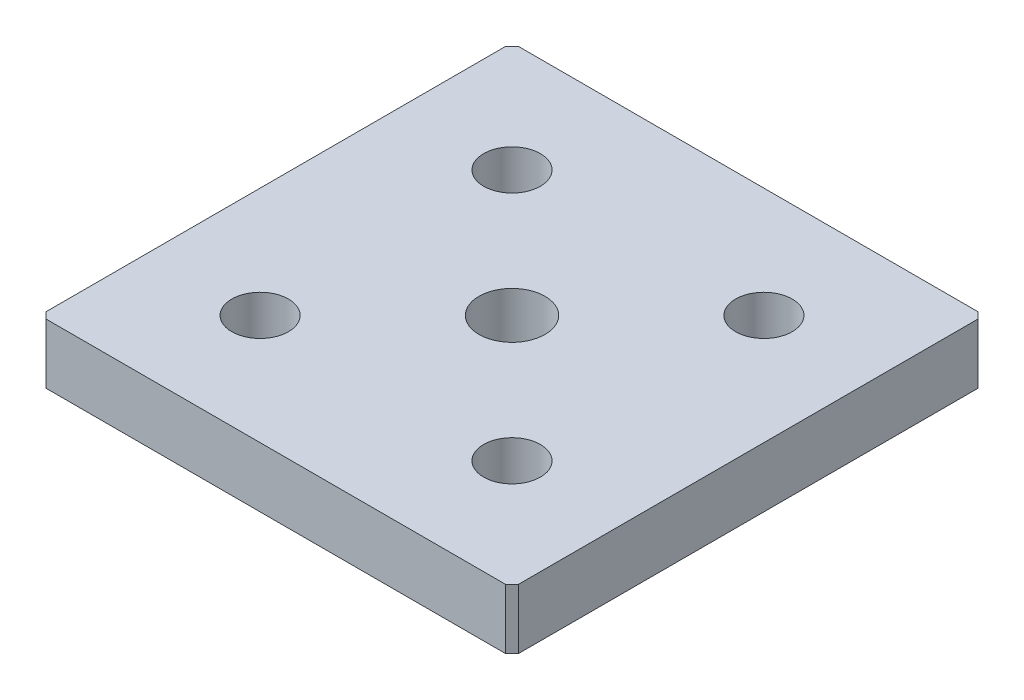
ISO-10303-21;
HEADER;
FILE_DESCRIPTION(('STEP AP214'),'2;1');
FILE_NAME('part.step','',(''),(''),'','','');
FILE_SCHEMA(('AUTOMOTIVE_DESIGN { 1 0 10303 214 1 1 1 1 }'));
ENDSEC;
DATA;
#1=APPLICATION_CONTEXT('core data for automotive mechanical design processes');
#2=APPLICATION_PROTOCOL_DEFINITION('international standard','automotive_design',2000,#1);
#3=PRODUCT_CONTEXT('',#1,'mechanical');
#4=PRODUCT('Part','Part','',(#3));
#5=PRODUCT_RELATED_PRODUCT_CATEGORY('part','',(#4));
#6=PRODUCT_DEFINITION_FORMATION('','',#4);
#7=PRODUCT_DEFINITION_CONTEXT('part definition',#1,'design');
#8=PRODUCT_DEFINITION('design','',#6,#7);
#9=PRODUCT_DEFINITION_SHAPE('','',#8);
#10=(LENGTH_UNIT() NAMED_UNIT(*) SI_UNIT(.MILLI.,.METRE.));
#11=(NAMED_UNIT(*) PLANE_ANGLE_UNIT() SI_UNIT($,.RADIAN.));
#12=(NAMED_UNIT(*) SI_UNIT($,.STERADIAN.) SOLID_ANGLE_UNIT());
#13=UNCERTAINTY_MEASURE_WITH_UNIT(LENGTH_MEASURE(1.E-05),#10,'distance_accuracy_value','');
#14=(GEOMETRIC_REPRESENTATION_CONTEXT(3) GLOBAL_UNCERTAINTY_ASSIGNED_CONTEXT((#13)) GLOBAL_UNIT_ASSIGNED_CONTEXT((#10,
#11,#12)) REPRESENTATION_CONTEXT('',''));
#15=CARTESIAN_POINT('',(0.,0.,0.));
#16=DIRECTION('',(0.,0.,1.));
#17=DIRECTION('',(1.,0.,0.));
#18=AXIS2_PLACEMENT_3D('',#15,#16,#17);
#19=CARTESIAN_POINT('',(37.5,4.7625,-37.5));
#20=DIRECTION('',(-1.,0.,0.));
#21=DIRECTION('',(0.,0.,1.));
#22=AXIS2_PLACEMENT_3D('',#19,#20,#21);
#23=PLANE('',#22);
#24=DIRECTION('',(0.,0.,-1.));
#25=VECTOR('',#24,1.);
#26=CARTESIAN_POINT('',(37.5,-4.7625,-37.5));
#27=LINE('',#26,#25);
#28=CARTESIAN_POINT('',(37.5,-4.7625,36.5));
#29=VERTEX_POINT('',#28);
#30=CARTESIAN_POINT('',(37.5,-4.7625,-36.5));
#31=VERTEX_POINT('',#30);
#32=EDGE_CURVE('E134',#29,#31,#27,.T.);
#33=ORIENTED_EDGE('',*,*,#32,.T.);
#34=DIRECTION('',(0.,1.,0.));
#35=VECTOR('',#34,1.);
#36=CARTESIAN_POINT('',(37.5,4.7625,-36.5));
#37=LINE('',#36,#35);
#38=CARTESIAN_POINT('',(37.5,4.7625,-36.5));
#39=VERTEX_POINT('',#38);
#40=EDGE_CURVE('E112',#31,#39,#37,.T.);
#41=ORIENTED_EDGE('',*,*,#40,.T.);
#42=DIRECTION('',(0.,0.,-1.));
#43=VECTOR('',#42,1.);
#44=CARTESIAN_POINT('',(37.5,4.7625,-37.5));
#45=LINE('',#44,#43);
#46=CARTESIAN_POINT('',(37.5,4.7625,36.5));
#47=VERTEX_POINT('',#46);
#48=EDGE_CURVE('E144',#47,#39,#45,.T.);
#49=ORIENTED_EDGE('',*,*,#48,.F.);
#50=DIRECTION('',(0.,-1.,0.));
#51=VECTOR('',#50,1.);
#52=CARTESIAN_POINT('',(37.5,4.7625,36.5));
#53=LINE('',#52,#51);
#54=EDGE_CURVE('E117',#47,#29,#53,.T.);
#55=ORIENTED_EDGE('',*,*,#54,.T.);
#56=EDGE_LOOP('',(#33,#41,#49,#55));
#57=FACE_BOUND('',#56,.T.);
#58=ADVANCED_FACE('F40',(#57),#23,.F.);
#59=CARTESIAN_POINT('',(-37.5,4.7625,-37.5));
#60=DIRECTION('',(0.,0.,1.));
#61=DIRECTION('',(1.,0.,0.));
#62=AXIS2_PLACEMENT_3D('',#59,#60,#61);
#63=PLANE('',#62);
#64=DIRECTION('',(-1.,0.,0.));
#65=VECTOR('',#64,1.);
#66=CARTESIAN_POINT('',(-37.5,4.7625,-37.5));
#67=LINE('',#66,#65);
#68=CARTESIAN_POINT('',(36.5,4.7625,-37.5));
#69=VERTEX_POINT('',#68);
#70=CARTESIAN_POINT('',(-36.5,4.7625,-37.5));
#71=VERTEX_POINT('',#70);
#72=EDGE_CURVE('E127',#69,#71,#67,.T.);
#73=ORIENTED_EDGE('',*,*,#72,.F.);
#74=DIRECTION('',(0.,-1.,0.));
#75=VECTOR('',#74,1.);
#76=CARTESIAN_POINT('',(36.5,4.7625,-37.5));
#77=LINE('',#76,#75);
#78=CARTESIAN_POINT('',(36.5,-4.7625,-37.5));
#79=VERTEX_POINT('',#78);
#80=EDGE_CURVE('E111',#69,#79,#77,.T.);
#81=ORIENTED_EDGE('',*,*,#80,.T.);
#82=DIRECTION('',(-1.,0.,0.));
#83=VECTOR('',#82,1.);
#84=CARTESIAN_POINT('',(-37.5,-4.7625,-37.5));
#85=LINE('',#84,#83);
#86=CARTESIAN_POINT('',(-36.5,-4.7625,-37.5));
#87=VERTEX_POINT('',#86);
#88=EDGE_CURVE('E124',#79,#87,#85,.T.);
#89=ORIENTED_EDGE('',*,*,#88,.T.);
#90=DIRECTION('',(0.,1.,0.));
#91=VECTOR('',#90,1.);
#92=CARTESIAN_POINT('',(-36.5,4.7625,-37.5));
#93=LINE('',#92,#91);
#94=EDGE_CURVE('E129',#87,#71,#93,.T.);
#95=ORIENTED_EDGE('',*,*,#94,.T.);
#96=EDGE_LOOP('',(#73,#81,#89,#95));
#97=FACE_BOUND('',#96,.T.);
#98=ADVANCED_FACE('F123',(#97),#63,.F.);
#99=CARTESIAN_POINT('',(-37.5,4.7625,-37.5));
#100=DIRECTION('',(1.,0.,0.));
#101=DIRECTION('',(0.,0.,-1.));
#102=AXIS2_PLACEMENT_3D('',#99,#100,#101);
#103=PLANE('',#102);
#104=DIRECTION('',(0.,0.,1.));
#105=VECTOR('',#104,1.);
#106=CARTESIAN_POINT('',(-37.5,-4.7625,-37.5));
#107=LINE('',#106,#105);
#108=CARTESIAN_POINT('',(-37.5,-4.7625,-36.5));
#109=VERTEX_POINT('',#108);
#110=CARTESIAN_POINT('',(-37.5,-4.7625,36.5));
#111=VERTEX_POINT('',#110);
#112=EDGE_CURVE('E133',#109,#111,#107,.T.);
#113=ORIENTED_EDGE('',*,*,#112,.T.);
#114=DIRECTION('',(0.,1.,0.));
#115=VECTOR('',#114,1.);
#116=CARTESIAN_POINT('',(-37.5,4.7625,36.5));
#117=LINE('',#116,#115);
#118=CARTESIAN_POINT('',(-37.5,4.7625,36.5));
#119=VERTEX_POINT('',#118);
#120=EDGE_CURVE('E11',#111,#119,#117,.T.);
#121=ORIENTED_EDGE('',*,*,#120,.T.);
#122=DIRECTION('',(0.,0.,1.));
#123=VECTOR('',#122,1.);
#124=CARTESIAN_POINT('',(-37.5,4.7625,-37.5));
#125=LINE('',#124,#123);
#126=CARTESIAN_POINT('',(-37.5,4.7625,-36.5));
#127=VERTEX_POINT('',#126);
#128=EDGE_CURVE('E170',#127,#119,#125,.T.);
#129=ORIENTED_EDGE('',*,*,#128,.F.);
#130=DIRECTION('',(0.,-1.,0.));
#131=VECTOR('',#130,1.);
#132=CARTESIAN_POINT('',(-37.5,4.7625,-36.5));
#133=LINE('',#132,#131);
#134=EDGE_CURVE('E49',#127,#109,#133,.T.);
#135=ORIENTED_EDGE('',*,*,#134,.T.);
#136=EDGE_LOOP('',(#113,#121,#129,#135));
#137=FACE_BOUND('',#136,.T.);
#138=ADVANCED_FACE('F168',(#137),#103,.F.);
#139=CARTESIAN_POINT('',(-37.5,4.7625,37.5));
#140=DIRECTION('',(0.,0.,-1.));
#141=DIRECTION('',(-1.,0.,0.));
#142=AXIS2_PLACEMENT_3D('',#139,#140,#141);
#143=PLANE('',#142);
#144=DIRECTION('',(1.,0.,0.));
#145=VECTOR('',#144,1.);
#146=CARTESIAN_POINT('',(-37.5,-4.7625,37.5));
#147=LINE('',#146,#145);
#148=CARTESIAN_POINT('',(-36.5,-4.7625,37.5));
#149=VERTEX_POINT('',#148);
#150=CARTESIAN_POINT('',(36.5,-4.7625,37.5));
#151=VERTEX_POINT('',#150);
#152=EDGE_CURVE('E137',#149,#151,#147,.T.);
#153=ORIENTED_EDGE('',*,*,#152,.T.);
#154=DIRECTION('',(0.,1.,0.));
#155=VECTOR('',#154,1.);
#156=CARTESIAN_POINT('',(36.5,4.7625,37.5));
#157=LINE('',#156,#155);
#158=CARTESIAN_POINT('',(36.5,4.7625,37.5));
#159=VERTEX_POINT('',#158);
#160=EDGE_CURVE('E56',#151,#159,#157,.T.);
#161=ORIENTED_EDGE('',*,*,#160,.T.);
#162=DIRECTION('',(1.,0.,0.));
#163=VECTOR('',#162,1.);
#164=CARTESIAN_POINT('',(-37.5,4.7625,37.5));
#165=LINE('',#164,#163);
#166=CARTESIAN_POINT('',(-36.5,4.7625,37.5));
#167=VERTEX_POINT('',#166);
#168=EDGE_CURVE('E145',#167,#159,#165,.T.);
#169=ORIENTED_EDGE('',*,*,#168,.F.);
#170=DIRECTION('',(0.,-1.,0.));
#171=VECTOR('',#170,1.);
#172=CARTESIAN_POINT('',(-36.5,4.7625,37.5));
#173=LINE('',#172,#171);
#174=EDGE_CURVE('E161',#167,#149,#173,.T.);
#175=ORIENTED_EDGE('',*,*,#174,.T.);
#176=EDGE_LOOP('',(#153,#161,#169,#175));
#177=FACE_BOUND('',#176,.T.);
#178=ADVANCED_FACE('F177',(#177),#143,.F.);
#179=CARTESIAN_POINT('',(0.,4.7625,0.));
#180=DIRECTION('',(0.,1.,0.));
#181=DIRECTION('',(0.,0.,1.));
#182=AXIS2_PLACEMENT_3D('',#179,#180,#181);
#183=PLANE('',#182);
#184=CARTESIAN_POINT('',(0.,4.7625,0.));
#185=DIRECTION('',(0.,1.,0.));
#186=DIRECTION('',(0.,0.,1.));
#187=AXIS2_PLACEMENT_3D('',#184,#185,#186);
#188=CIRCLE('',#187,5.25);
#189=CARTESIAN_POINT('',(0.,4.7625,5.25));
#190=VERTEX_POINT('',#189);
#191=EDGE_CURVE('E210',#190,#190,#188,.T.);
#192=ORIENTED_EDGE('',*,*,#191,.F.);
#193=EDGE_LOOP('',(#192));
#194=FACE_BOUND('',#193,.T.);
#195=CARTESIAN_POINT('',(-20.,4.7625,-20.));
#196=DIRECTION('',(0.,1.,0.));
#197=DIRECTION('',(0.,0.,1.));
#198=AXIS2_PLACEMENT_3D('',#195,#196,#197);
#199=CIRCLE('',#198,4.5);
#200=CARTESIAN_POINT('',(-20.,4.7625,-15.5));
#201=VERTEX_POINT('',#200);
#202=EDGE_CURVE('E204',#201,#201,#199,.T.);
#203=ORIENTED_EDGE('',*,*,#202,.F.);
#204=EDGE_LOOP('',(#203));
#205=FACE_BOUND('',#204,.T.);
#206=CARTESIAN_POINT('',(20.,4.7625,-20.));
#207=DIRECTION('',(0.,1.,0.));
#208=DIRECTION('',(0.,0.,1.));
#209=AXIS2_PLACEMENT_3D('',#206,#207,#208);
#210=CIRCLE('',#209,4.5);
#211=CARTESIAN_POINT('',(20.,4.7625,-15.5));
#212=VERTEX_POINT('',#211);
#213=EDGE_CURVE('E198',#212,#212,#210,.T.);
#214=ORIENTED_EDGE('',*,*,#213,.F.);
#215=EDGE_LOOP('',(#214));
#216=FACE_BOUND('',#215,.T.);
#217=CARTESIAN_POINT('',(-20.,4.7625,20.));
#218=DIRECTION('',(0.,1.,0.));
#219=DIRECTION('',(0.,0.,1.));
#220=AXIS2_PLACEMENT_3D('',#217,#218,#219);
#221=CIRCLE('',#220,4.5);
#222=CARTESIAN_POINT('',(-20.,4.7625,24.5));
#223=VERTEX_POINT('',#222);
#224=EDGE_CURVE('E192',#223,#223,#221,.T.);
#225=ORIENTED_EDGE('',*,*,#224,.F.);
#226=EDGE_LOOP('',(#225));
#227=FACE_BOUND('',#226,.T.);
#228=CARTESIAN_POINT('',(20.,4.7625,20.));
#229=DIRECTION('',(0.,1.,0.));
#230=DIRECTION('',(0.,0.,1.));
#231=AXIS2_PLACEMENT_3D('',#228,#229,#230);
#232=CIRCLE('',#231,4.5);
#233=CARTESIAN_POINT('',(20.,4.7625,24.5));
#234=VERTEX_POINT('',#233);
#235=EDGE_CURVE('E186',#234,#234,#232,.T.);
#236=ORIENTED_EDGE('',*,*,#235,.F.);
#237=EDGE_LOOP('',(#236));
#238=FACE_BOUND('',#237,.T.);
#239=ORIENTED_EDGE('',*,*,#48,.T.);
#240=DIRECTION('',(0.707106781186552,0.,0.707106781186543));
#241=VECTOR('',#240,1.);
#242=CARTESIAN_POINT('',(36.9999999999997,4.7625,-37.0000000000002));
#243=LINE('',#242,#241);
#244=EDGE_CURVE('E159',#39,#69,#243,.F.);
#245=ORIENTED_EDGE('',*,*,#244,.T.);
#246=ORIENTED_EDGE('',*,*,#72,.T.);
#247=DIRECTION('',(0.707106781186552,0.,-0.707106781186543));
#248=VECTOR('',#247,1.);
#249=CARTESIAN_POINT('',(-36.9999999999998,4.7625,-37.0000000000003));
#250=LINE('',#249,#248);
#251=EDGE_CURVE('E154',#71,#127,#250,.F.);
#252=ORIENTED_EDGE('',*,*,#251,.T.);
#253=ORIENTED_EDGE('',*,*,#128,.T.);
#254=DIRECTION('',(-0.707106781186543,0.,-0.707106781186552));
#255=VECTOR('',#254,1.);
#256=CARTESIAN_POINT('',(-37.0000000000002,4.7625,36.9999999999997));
#257=LINE('',#256,#255);
#258=EDGE_CURVE('E63',#119,#167,#257,.F.);
#259=ORIENTED_EDGE('',*,*,#258,.T.);
#260=ORIENTED_EDGE('',*,*,#168,.T.);
#261=DIRECTION('',(-0.707106781186555,0.,0.70710678118654));
#262=VECTOR('',#261,1.);
#263=CARTESIAN_POINT('',(36.9999999999996,4.7625,37.0000000000004));
#264=LINE('',#263,#262);
#265=EDGE_CURVE('E157',#159,#47,#264,.F.);
#266=ORIENTED_EDGE('',*,*,#265,.T.);
#267=EDGE_LOOP('',(#239,#245,#246,#252,#253,#259,#260,#266));
#268=FACE_BOUND('',#267,.T.);
#269=ADVANCED_FACE('F216',(#194,#205,#216,#227,#238,#268),#183,.T.);
#270=CARTESIAN_POINT('',(0.,-4.7625,0.));
#271=DIRECTION('',(0.,1.,0.));
#272=DIRECTION('',(0.,0.,1.));
#273=AXIS2_PLACEMENT_3D('',#270,#271,#272);
#274=PLANE('',#273);
#275=CARTESIAN_POINT('',(0.,-4.7625,0.));
#276=DIRECTION('',(0.,1.,0.));
#277=DIRECTION('',(0.,0.,1.));
#278=AXIS2_PLACEMENT_3D('',#275,#276,#277);
#279=CIRCLE('',#278,5.25);
#280=CARTESIAN_POINT('',(0.,-4.7625,5.25));
#281=VERTEX_POINT('',#280);
#282=EDGE_CURVE('E207',#281,#281,#279,.T.);
#283=ORIENTED_EDGE('',*,*,#282,.T.);
#284=EDGE_LOOP('',(#283));
#285=FACE_BOUND('',#284,.T.);
#286=CARTESIAN_POINT('',(-20.,-4.7625,-20.));
#287=DIRECTION('',(0.,1.,0.));
#288=DIRECTION('',(0.,0.,1.));
#289=AXIS2_PLACEMENT_3D('',#286,#287,#288);
#290=CIRCLE('',#289,4.5);
#291=CARTESIAN_POINT('',(-20.,-4.7625,-15.5));
#292=VERTEX_POINT('',#291);
#293=EDGE_CURVE('E201',#292,#292,#290,.T.);
#294=ORIENTED_EDGE('',*,*,#293,.T.);
#295=EDGE_LOOP('',(#294));
#296=FACE_BOUND('',#295,.T.);
#297=CARTESIAN_POINT('',(20.,-4.7625,-20.));
#298=DIRECTION('',(0.,1.,0.));
#299=DIRECTION('',(0.,0.,1.));
#300=AXIS2_PLACEMENT_3D('',#297,#298,#299);
#301=CIRCLE('',#300,4.5);
#302=CARTESIAN_POINT('',(20.,-4.7625,-15.5));
#303=VERTEX_POINT('',#302);
#304=EDGE_CURVE('E195',#303,#303,#301,.T.);
#305=ORIENTED_EDGE('',*,*,#304,.T.);
#306=EDGE_LOOP('',(#305));
#307=FACE_BOUND('',#306,.T.);
#308=CARTESIAN_POINT('',(-20.,-4.7625,20.));
#309=DIRECTION('',(0.,1.,0.));
#310=DIRECTION('',(0.,0.,1.));
#311=AXIS2_PLACEMENT_3D('',#308,#309,#310);
#312=CIRCLE('',#311,4.5);
#313=CARTESIAN_POINT('',(-20.,-4.7625,24.5));
#314=VERTEX_POINT('',#313);
#315=EDGE_CURVE('E189',#314,#314,#312,.T.);
#316=ORIENTED_EDGE('',*,*,#315,.T.);
#317=EDGE_LOOP('',(#316));
#318=FACE_BOUND('',#317,.T.);
#319=CARTESIAN_POINT('',(20.,-4.7625,20.));
#320=DIRECTION('',(0.,1.,0.));
#321=DIRECTION('',(0.,0.,1.));
#322=AXIS2_PLACEMENT_3D('',#319,#320,#321);
#323=CIRCLE('',#322,4.5);
#324=CARTESIAN_POINT('',(20.,-4.7625,24.5));
#325=VERTEX_POINT('',#324);
#326=EDGE_CURVE('E139',#325,#325,#323,.T.);
#327=ORIENTED_EDGE('',*,*,#326,.T.);
#328=EDGE_LOOP('',(#327));
#329=FACE_BOUND('',#328,.T.);
#330=ORIENTED_EDGE('',*,*,#88,.F.);
#331=DIRECTION('',(-0.707106781186552,0.,-0.707106781186543));
#332=VECTOR('',#331,1.);
#333=CARTESIAN_POINT('',(36.5,-4.7625,-37.5));
#334=LINE('',#333,#332);
#335=EDGE_CURVE('E107',#79,#31,#334,.F.);
#336=ORIENTED_EDGE('',*,*,#335,.T.);
#337=ORIENTED_EDGE('',*,*,#32,.F.);
#338=DIRECTION('',(0.707106781186555,0.,-0.70710678118654));
#339=VECTOR('',#338,1.);
#340=CARTESIAN_POINT('',(37.5,-4.7625,36.5));
#341=LINE('',#340,#339);
#342=EDGE_CURVE('E118',#29,#151,#341,.F.);
#343=ORIENTED_EDGE('',*,*,#342,.T.);
#344=ORIENTED_EDGE('',*,*,#152,.F.);
#345=DIRECTION('',(0.707106781186543,0.,0.707106781186552));
#346=VECTOR('',#345,1.);
#347=CARTESIAN_POINT('',(-36.5,-4.7625,37.5));
#348=LINE('',#347,#346);
#349=EDGE_CURVE('E148',#149,#111,#348,.F.);
#350=ORIENTED_EDGE('',*,*,#349,.T.);
#351=ORIENTED_EDGE('',*,*,#112,.F.);
#352=DIRECTION('',(-0.707106781186552,0.,0.707106781186543));
#353=VECTOR('',#352,1.);
#354=CARTESIAN_POINT('',(-37.5,-4.7625,-36.5));
#355=LINE('',#354,#353);
#356=EDGE_CURVE('E128',#109,#87,#355,.F.);
#357=ORIENTED_EDGE('',*,*,#356,.T.);
#358=EDGE_LOOP('',(#330,#336,#337,#343,#344,#350,#351,#357));
#359=FACE_BOUND('',#358,.T.);
#360=ADVANCED_FACE('F131',(#285,#296,#307,#318,#329,#359),#274,.F.);
#361=CARTESIAN_POINT('',(20.,4.7625,20.));
#362=DIRECTION('',(0.,1.,0.));
#363=DIRECTION('',(0.,0.,1.));
#364=AXIS2_PLACEMENT_3D('',#361,#362,#363);
#365=CYLINDRICAL_SURFACE('',#364,4.5);
#366=ORIENTED_EDGE('',*,*,#326,.F.);
#367=EDGE_LOOP('',(#366));
#368=FACE_BOUND('',#367,.T.);
#369=ORIENTED_EDGE('',*,*,#235,.T.);
#370=EDGE_LOOP('',(#369));
#371=FACE_BOUND('',#370,.T.);
#372=ADVANCED_FACE('F262',(#368,#371),#365,.F.);
#373=CARTESIAN_POINT('',(-20.,4.7625,20.));
#374=DIRECTION('',(0.,1.,0.));
#375=DIRECTION('',(0.,0.,1.));
#376=AXIS2_PLACEMENT_3D('',#373,#374,#375);
#377=CYLINDRICAL_SURFACE('',#376,4.5);
#378=ORIENTED_EDGE('',*,*,#315,.F.);
#379=EDGE_LOOP('',(#378));
#380=FACE_BOUND('',#379,.T.);
#381=ORIENTED_EDGE('',*,*,#224,.T.);
#382=EDGE_LOOP('',(#381));
#383=FACE_BOUND('',#382,.T.);
#384=ADVANCED_FACE('F267',(#380,#383),#377,.F.);
#385=CARTESIAN_POINT('',(20.,4.7625,-20.));
#386=DIRECTION('',(0.,1.,0.));
#387=DIRECTION('',(0.,0.,1.));
#388=AXIS2_PLACEMENT_3D('',#385,#386,#387);
#389=CYLINDRICAL_SURFACE('',#388,4.5);
#390=ORIENTED_EDGE('',*,*,#304,.F.);
#391=EDGE_LOOP('',(#390));
#392=FACE_BOUND('',#391,.T.);
#393=ORIENTED_EDGE('',*,*,#213,.T.);
#394=EDGE_LOOP('',(#393));
#395=FACE_BOUND('',#394,.T.);
#396=ADVANCED_FACE('F271',(#392,#395),#389,.F.);
#397=CARTESIAN_POINT('',(-20.,4.7625,-20.));
#398=DIRECTION('',(0.,1.,0.));
#399=DIRECTION('',(0.,0.,1.));
#400=AXIS2_PLACEMENT_3D('',#397,#398,#399);
#401=CYLINDRICAL_SURFACE('',#400,4.5);
#402=ORIENTED_EDGE('',*,*,#293,.F.);
#403=EDGE_LOOP('',(#402));
#404=FACE_BOUND('',#403,.T.);
#405=ORIENTED_EDGE('',*,*,#202,.T.);
#406=EDGE_LOOP('',(#405));
#407=FACE_BOUND('',#406,.T.);
#408=ADVANCED_FACE('F275',(#404,#407),#401,.F.);
#409=CARTESIAN_POINT('',(0.,4.7625,0.));
#410=DIRECTION('',(0.,1.,0.));
#411=DIRECTION('',(0.,0.,1.));
#412=AXIS2_PLACEMENT_3D('',#409,#410,#411);
#413=CYLINDRICAL_SURFACE('',#412,5.25);
#414=ORIENTED_EDGE('',*,*,#282,.F.);
#415=EDGE_LOOP('',(#414));
#416=FACE_BOUND('',#415,.T.);
#417=ORIENTED_EDGE('',*,*,#191,.T.);
#418=EDGE_LOOP('',(#417));
#419=FACE_BOUND('',#418,.T.);
#420=ADVANCED_FACE('F214',(#416,#419),#413,.F.);
#421=CARTESIAN_POINT('',(36.5,4.7625,-37.5));
#422=DIRECTION('',(-0.707106781186543,0.,0.707106781186552));
#423=DIRECTION('',(0.,-1.,0.));
#424=AXIS2_PLACEMENT_3D('',#421,#422,#423);
#425=PLANE('',#424);
#426=ORIENTED_EDGE('',*,*,#244,.F.);
#427=ORIENTED_EDGE('',*,*,#40,.F.);
#428=ORIENTED_EDGE('',*,*,#335,.F.);
#429=ORIENTED_EDGE('',*,*,#80,.F.);
#430=EDGE_LOOP('',(#426,#427,#428,#429));
#431=FACE_BOUND('',#430,.T.);
#432=ADVANCED_FACE('F110',(#431),#425,.F.);
#433=CARTESIAN_POINT('',(37.5,4.7625,36.5));
#434=DIRECTION('',(-0.70710678118654,0.,-0.707106781186555));
#435=DIRECTION('',(0.,-1.,0.));
#436=AXIS2_PLACEMENT_3D('',#433,#434,#435);
#437=PLANE('',#436);
#438=ORIENTED_EDGE('',*,*,#265,.F.);
#439=ORIENTED_EDGE('',*,*,#160,.F.);
#440=ORIENTED_EDGE('',*,*,#342,.F.);
#441=ORIENTED_EDGE('',*,*,#54,.F.);
#442=EDGE_LOOP('',(#438,#439,#440,#441));
#443=FACE_BOUND('',#442,.T.);
#444=ADVANCED_FACE('F231',(#443),#437,.F.);
#445=CARTESIAN_POINT('',(-36.5,4.7625,37.5));
#446=DIRECTION('',(0.707106781186552,0.,-0.707106781186543));
#447=DIRECTION('',(0.,-1.,0.));
#448=AXIS2_PLACEMENT_3D('',#445,#446,#447);
#449=PLANE('',#448);
#450=ORIENTED_EDGE('',*,*,#258,.F.);
#451=ORIENTED_EDGE('',*,*,#120,.F.);
#452=ORIENTED_EDGE('',*,*,#349,.F.);
#453=ORIENTED_EDGE('',*,*,#174,.F.);
#454=EDGE_LOOP('',(#450,#451,#452,#453));
#455=FACE_BOUND('',#454,.T.);
#456=ADVANCED_FACE('F176',(#455),#449,.F.);
#457=CARTESIAN_POINT('',(-37.5,4.7625,-36.5));
#458=DIRECTION('',(0.707106781186542,0.,0.707106781186552));
#459=DIRECTION('',(0.,-1.,0.));
#460=AXIS2_PLACEMENT_3D('',#457,#458,#459);
#461=PLANE('',#460);
#462=ORIENTED_EDGE('',*,*,#251,.F.);
#463=ORIENTED_EDGE('',*,*,#94,.F.);
#464=ORIENTED_EDGE('',*,*,#356,.F.);
#465=ORIENTED_EDGE('',*,*,#134,.F.);
#466=EDGE_LOOP('',(#462,#463,#464,#465));
#467=FACE_BOUND('',#466,.T.);
#468=ADVANCED_FACE('F43',(#467),#461,.F.);
#469=CLOSED_SHELL('',(#58,#98,#138,#178,#269,#360,#372,#384,#396,#408,#420,#432,#444,#456,#468));
#470=MANIFOLD_SOLID_BREP('B2',#469);
#471=ADVANCED_BREP_SHAPE_REPRESENTATION('',(#18,#470),#14);
#472=SHAPE_DEFINITION_REPRESENTATION(#9,#471);
ENDSEC;
END-ISO-10303-21;
